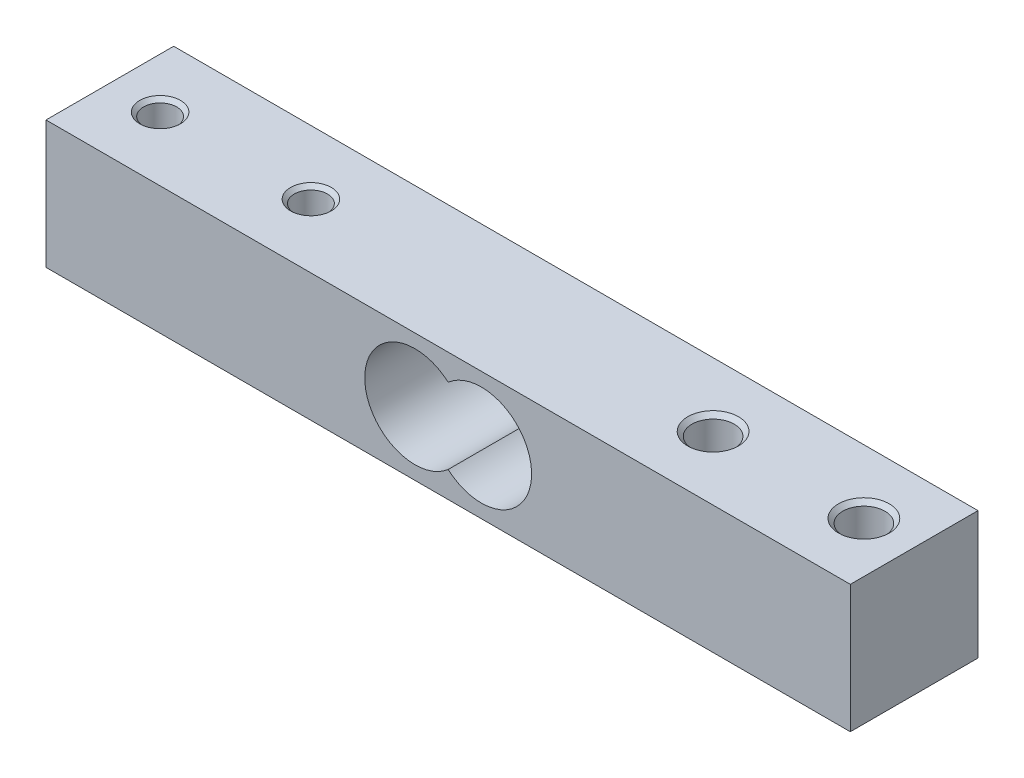
ISO-10303-21;
HEADER;
FILE_DESCRIPTION(('STEP AP214'),'2;1');
FILE_NAME('part.step','',(''),(''),'','','');
FILE_SCHEMA(('AUTOMOTIVE_DESIGN { 1 0 10303 214 1 1 1 1 }'));
ENDSEC;
DATA;
#1=APPLICATION_CONTEXT('core data for automotive mechanical design processes');
#2=APPLICATION_PROTOCOL_DEFINITION('international standard','automotive_design',2000,#1);
#3=PRODUCT_CONTEXT('',#1,'mechanical');
#4=PRODUCT('Part','Part','',(#3));
#5=PRODUCT_RELATED_PRODUCT_CATEGORY('part','',(#4));
#6=PRODUCT_DEFINITION_FORMATION('','',#4);
#7=PRODUCT_DEFINITION_CONTEXT('part definition',#1,'design');
#8=PRODUCT_DEFINITION('design','',#6,#7);
#9=PRODUCT_DEFINITION_SHAPE('','',#8);
#10=(LENGTH_UNIT() NAMED_UNIT(*) SI_UNIT(.MILLI.,.METRE.));
#11=(NAMED_UNIT(*) PLANE_ANGLE_UNIT() SI_UNIT($,.RADIAN.));
#12=(NAMED_UNIT(*) SI_UNIT($,.STERADIAN.) SOLID_ANGLE_UNIT());
#13=UNCERTAINTY_MEASURE_WITH_UNIT(LENGTH_MEASURE(1.E-05),#10,'distance_accuracy_value','');
#14=(GEOMETRIC_REPRESENTATION_CONTEXT(3) GLOBAL_UNCERTAINTY_ASSIGNED_CONTEXT((#13)) GLOBAL_UNIT_ASSIGNED_CONTEXT((#10,
#11,#12)) REPRESENTATION_CONTEXT('',''));
#15=CARTESIAN_POINT('',(0.,0.,0.));
#16=DIRECTION('',(0.,0.,1.));
#17=DIRECTION('',(1.,0.,0.));
#18=AXIS2_PLACEMENT_3D('',#15,#16,#17);
#19=CARTESIAN_POINT('',(40.,12.7,6.35));
#20=DIRECTION('',(-1.,0.,0.));
#21=DIRECTION('',(0.,0.,1.));
#22=AXIS2_PLACEMENT_3D('',#19,#20,#21);
#23=PLANE('',#22);
#24=DIRECTION('',(0.,0.,-1.));
#25=VECTOR('',#24,1.);
#26=CARTESIAN_POINT('',(40.,0.,6.35));
#27=LINE('',#26,#25);
#28=CARTESIAN_POINT('',(40.,0.,6.35));
#29=VERTEX_POINT('',#28);
#30=CARTESIAN_POINT('',(40.,0.,-6.35));
#31=VERTEX_POINT('',#30);
#32=EDGE_CURVE('E124',#29,#31,#27,.T.);
#33=ORIENTED_EDGE('',*,*,#32,.T.);
#34=DIRECTION('',(0.,-1.,0.));
#35=VECTOR('',#34,1.);
#36=CARTESIAN_POINT('',(40.,12.7,-6.35));
#37=LINE('',#36,#35);
#38=CARTESIAN_POINT('',(40.,12.7,-6.35));
#39=VERTEX_POINT('',#38);
#40=EDGE_CURVE('E11',#39,#31,#37,.T.);
#41=ORIENTED_EDGE('',*,*,#40,.F.);
#42=DIRECTION('',(0.,0.,-1.));
#43=VECTOR('',#42,1.);
#44=CARTESIAN_POINT('',(40.,12.7,6.35));
#45=LINE('',#44,#43);
#46=CARTESIAN_POINT('',(40.,12.7,6.35));
#47=VERTEX_POINT('',#46);
#48=EDGE_CURVE('E126',#47,#39,#45,.T.);
#49=ORIENTED_EDGE('',*,*,#48,.F.);
#50=DIRECTION('',(0.,-1.,0.));
#51=VECTOR('',#50,1.);
#52=CARTESIAN_POINT('',(40.,12.7,6.35));
#53=LINE('',#52,#51);
#54=EDGE_CURVE('E136',#47,#29,#53,.T.);
#55=ORIENTED_EDGE('',*,*,#54,.T.);
#56=EDGE_LOOP('',(#33,#41,#49,#55));
#57=FACE_BOUND('',#56,.T.);
#58=ADVANCED_FACE('F53',(#57),#23,.F.);
#59=CARTESIAN_POINT('',(-40.,12.7,-6.35));
#60=DIRECTION('',(0.,0.,1.));
#61=DIRECTION('',(1.,0.,0.));
#62=AXIS2_PLACEMENT_3D('',#59,#60,#61);
#63=PLANE('',#62);
#64=CARTESIAN_POINT('',(-3.3,6.35,-6.35));
#65=DIRECTION('',(0.,0.,1.));
#66=DIRECTION('',(1.,0.,0.));
#67=AXIS2_PLACEMENT_3D('',#64,#65,#66);
#68=CIRCLE('',#67,5.);
#69=CARTESIAN_POINT('',(0.,10.1063279941986,-6.35));
#70=VERTEX_POINT('',#69);
#71=CARTESIAN_POINT('',(0.,2.59367200580141,-6.35));
#72=VERTEX_POINT('',#71);
#73=EDGE_CURVE('E108',#70,#72,#68,.T.);
#74=ORIENTED_EDGE('',*,*,#73,.T.);
#75=CARTESIAN_POINT('',(3.3,6.35,-6.35));
#76=DIRECTION('',(0.,0.,1.));
#77=DIRECTION('',(1.,0.,0.));
#78=AXIS2_PLACEMENT_3D('',#75,#76,#77);
#79=CIRCLE('',#78,5.);
#80=EDGE_CURVE('E67',#72,#70,#79,.T.);
#81=ORIENTED_EDGE('',*,*,#80,.T.);
#82=EDGE_LOOP('',(#74,#81));
#83=FACE_BOUND('',#82,.T.);
#84=DIRECTION('',(-1.,0.,0.));
#85=VECTOR('',#84,1.);
#86=CARTESIAN_POINT('',(-40.,0.,-6.35));
#87=LINE('',#86,#85);
#88=CARTESIAN_POINT('',(-40.,0.,-6.35));
#89=VERTEX_POINT('',#88);
#90=EDGE_CURVE('E139',#31,#89,#87,.T.);
#91=ORIENTED_EDGE('',*,*,#90,.T.);
#92=DIRECTION('',(0.,-1.,0.));
#93=VECTOR('',#92,1.);
#94=CARTESIAN_POINT('',(-40.,12.7,-6.35));
#95=LINE('',#94,#93);
#96=CARTESIAN_POINT('',(-40.,12.7,-6.35));
#97=VERTEX_POINT('',#96);
#98=EDGE_CURVE('E60',#97,#89,#95,.T.);
#99=ORIENTED_EDGE('',*,*,#98,.F.);
#100=DIRECTION('',(-1.,0.,0.));
#101=VECTOR('',#100,1.);
#102=CARTESIAN_POINT('',(-40.,12.7,-6.35));
#103=LINE('',#102,#101);
#104=EDGE_CURVE('E129',#39,#97,#103,.T.);
#105=ORIENTED_EDGE('',*,*,#104,.F.);
#106=ORIENTED_EDGE('',*,*,#40,.T.);
#107=EDGE_LOOP('',(#91,#99,#105,#106));
#108=FACE_BOUND('',#107,.T.);
#109=ADVANCED_FACE('F114',(#83,#108),#63,.F.);
#110=CARTESIAN_POINT('',(-40.,12.7,6.35));
#111=DIRECTION('',(1.,0.,0.));
#112=DIRECTION('',(0.,0.,-1.));
#113=AXIS2_PLACEMENT_3D('',#110,#111,#112);
#114=PLANE('',#113);
#115=DIRECTION('',(0.,0.,1.));
#116=VECTOR('',#115,1.);
#117=CARTESIAN_POINT('',(-40.,0.,6.35));
#118=LINE('',#117,#116);
#119=CARTESIAN_POINT('',(-40.,0.,6.35));
#120=VERTEX_POINT('',#119);
#121=EDGE_CURVE('E141',#89,#120,#118,.T.);
#122=ORIENTED_EDGE('',*,*,#121,.T.);
#123=DIRECTION('',(0.,-1.,0.));
#124=VECTOR('',#123,1.);
#125=CARTESIAN_POINT('',(-40.,12.7,6.35));
#126=LINE('',#125,#124);
#127=CARTESIAN_POINT('',(-40.,12.7,6.35));
#128=VERTEX_POINT('',#127);
#129=EDGE_CURVE('E146',#128,#120,#126,.T.);
#130=ORIENTED_EDGE('',*,*,#129,.F.);
#131=DIRECTION('',(0.,0.,1.));
#132=VECTOR('',#131,1.);
#133=CARTESIAN_POINT('',(-40.,12.7,6.35));
#134=LINE('',#133,#132);
#135=EDGE_CURVE('E132',#97,#128,#134,.T.);
#136=ORIENTED_EDGE('',*,*,#135,.F.);
#137=ORIENTED_EDGE('',*,*,#98,.T.);
#138=EDGE_LOOP('',(#122,#130,#136,#137));
#139=FACE_BOUND('',#138,.T.);
#140=ADVANCED_FACE('F153',(#139),#114,.F.);
#141=CARTESIAN_POINT('',(-40.,12.7,6.35));
#142=DIRECTION('',(0.,0.,-1.));
#143=DIRECTION('',(-1.,0.,0.));
#144=AXIS2_PLACEMENT_3D('',#141,#142,#143);
#145=PLANE('',#144);
#146=CARTESIAN_POINT('',(-3.3,6.35,6.35));
#147=DIRECTION('',(0.,0.,1.));
#148=DIRECTION('',(1.,0.,0.));
#149=AXIS2_PLACEMENT_3D('',#146,#147,#148);
#150=CIRCLE('',#149,5.);
#151=CARTESIAN_POINT('',(0.,10.1063279941986,6.35));
#152=VERTEX_POINT('',#151);
#153=CARTESIAN_POINT('',(0.,2.59367200580141,6.35));
#154=VERTEX_POINT('',#153);
#155=EDGE_CURVE('E116',#152,#154,#150,.T.);
#156=ORIENTED_EDGE('',*,*,#155,.F.);
#157=CARTESIAN_POINT('',(3.3,6.35,6.35));
#158=DIRECTION('',(0.,0.,1.));
#159=DIRECTION('',(1.,0.,0.));
#160=AXIS2_PLACEMENT_3D('',#157,#158,#159);
#161=CIRCLE('',#160,5.);
#162=EDGE_CURVE('E72',#154,#152,#161,.T.);
#163=ORIENTED_EDGE('',*,*,#162,.F.);
#164=EDGE_LOOP('',(#156,#163));
#165=FACE_BOUND('',#164,.T.);
#166=DIRECTION('',(1.,0.,0.));
#167=VECTOR('',#166,1.);
#168=CARTESIAN_POINT('',(-40.,0.,6.35));
#169=LINE('',#168,#167);
#170=EDGE_CURVE('E130',#120,#29,#169,.T.);
#171=ORIENTED_EDGE('',*,*,#170,.T.);
#172=ORIENTED_EDGE('',*,*,#54,.F.);
#173=DIRECTION('',(1.,0.,0.));
#174=VECTOR('',#173,1.);
#175=CARTESIAN_POINT('',(-40.,12.7,6.35));
#176=LINE('',#175,#174);
#177=EDGE_CURVE('E134',#128,#47,#176,.T.);
#178=ORIENTED_EDGE('',*,*,#177,.F.);
#179=ORIENTED_EDGE('',*,*,#129,.T.);
#180=EDGE_LOOP('',(#171,#172,#178,#179));
#181=FACE_BOUND('',#180,.T.);
#182=ADVANCED_FACE('F161',(#165,#181),#145,.F.);
#183=CARTESIAN_POINT('',(0.,12.7,0.));
#184=DIRECTION('',(0.,-1.,0.));
#185=DIRECTION('',(0.,0.,-1.));
#186=AXIS2_PLACEMENT_3D('',#183,#184,#185);
#187=PLANE('',#186);
#188=CARTESIAN_POINT('',(35.,12.7,0.));
#189=DIRECTION('',(0.,1.,0.));
#190=DIRECTION('',(0.,0.,1.));
#191=AXIS2_PLACEMENT_3D('',#188,#189,#190);
#192=CIRCLE('',#191,2.525);
#193=CARTESIAN_POINT('',(35.,12.7,2.525));
#194=VERTEX_POINT('',#193);
#195=EDGE_CURVE('E228',#194,#194,#192,.T.);
#196=ORIENTED_EDGE('',*,*,#195,.F.);
#197=EDGE_LOOP('',(#196));
#198=FACE_BOUND('',#197,.T.);
#199=CARTESIAN_POINT('',(20.,12.7,0.));
#200=DIRECTION('',(0.,1.,0.));
#201=DIRECTION('',(0.,0.,1.));
#202=AXIS2_PLACEMENT_3D('',#199,#200,#201);
#203=CIRCLE('',#202,2.525);
#204=CARTESIAN_POINT('',(20.,12.7,2.525));
#205=VERTEX_POINT('',#204);
#206=EDGE_CURVE('E235',#205,#205,#203,.T.);
#207=ORIENTED_EDGE('',*,*,#206,.F.);
#208=EDGE_LOOP('',(#207));
#209=FACE_BOUND('',#208,.T.);
#210=CARTESIAN_POINT('',(-35.,12.7,0.));
#211=DIRECTION('',(0.,1.,0.));
#212=DIRECTION('',(0.,0.,1.));
#213=AXIS2_PLACEMENT_3D('',#210,#211,#212);
#214=CIRCLE('',#213,2.025);
#215=CARTESIAN_POINT('',(-35.,12.7,2.025));
#216=VERTEX_POINT('',#215);
#217=EDGE_CURVE('E244',#216,#216,#214,.T.);
#218=ORIENTED_EDGE('',*,*,#217,.F.);
#219=EDGE_LOOP('',(#218));
#220=FACE_BOUND('',#219,.T.);
#221=CARTESIAN_POINT('',(-20.,12.7,0.));
#222=DIRECTION('',(0.,1.,0.));
#223=DIRECTION('',(0.,0.,1.));
#224=AXIS2_PLACEMENT_3D('',#221,#222,#223);
#225=CIRCLE('',#224,2.025);
#226=CARTESIAN_POINT('',(-20.,12.7,2.025));
#227=VERTEX_POINT('',#226);
#228=EDGE_CURVE('E253',#227,#227,#225,.T.);
#229=ORIENTED_EDGE('',*,*,#228,.F.);
#230=EDGE_LOOP('',(#229));
#231=FACE_BOUND('',#230,.T.);
#232=ORIENTED_EDGE('',*,*,#48,.T.);
#233=ORIENTED_EDGE('',*,*,#104,.T.);
#234=ORIENTED_EDGE('',*,*,#135,.T.);
#235=ORIENTED_EDGE('',*,*,#177,.T.);
#236=EDGE_LOOP('',(#232,#233,#234,#235));
#237=FACE_BOUND('',#236,.T.);
#238=ADVANCED_FACE('F167',(#198,#209,#220,#231,#237),#187,.F.);
#239=CARTESIAN_POINT('',(0.,0.,0.));
#240=DIRECTION('',(0.,-1.,0.));
#241=DIRECTION('',(0.,0.,-1.));
#242=AXIS2_PLACEMENT_3D('',#239,#240,#241);
#243=PLANE('',#242);
#244=CARTESIAN_POINT('',(35.,0.,0.));
#245=DIRECTION('',(0.,1.,0.));
#246=DIRECTION('',(0.,0.,1.));
#247=AXIS2_PLACEMENT_3D('',#244,#245,#246);
#248=CIRCLE('',#247,2.1);
#249=CARTESIAN_POINT('',(35.,0.,2.1));
#250=VERTEX_POINT('',#249);
#251=EDGE_CURVE('E230',#250,#250,#248,.T.);
#252=ORIENTED_EDGE('',*,*,#251,.T.);
#253=EDGE_LOOP('',(#252));
#254=FACE_BOUND('',#253,.T.);
#255=CARTESIAN_POINT('',(20.,0.,0.));
#256=DIRECTION('',(0.,1.,0.));
#257=DIRECTION('',(0.,0.,1.));
#258=AXIS2_PLACEMENT_3D('',#255,#256,#257);
#259=CIRCLE('',#258,2.1);
#260=CARTESIAN_POINT('',(20.,0.,2.1));
#261=VERTEX_POINT('',#260);
#262=EDGE_CURVE('E241',#261,#261,#259,.T.);
#263=ORIENTED_EDGE('',*,*,#262,.T.);
#264=EDGE_LOOP('',(#263));
#265=FACE_BOUND('',#264,.T.);
#266=CARTESIAN_POINT('',(-35.,0.,0.));
#267=DIRECTION('',(0.,1.,0.));
#268=DIRECTION('',(0.,0.,1.));
#269=AXIS2_PLACEMENT_3D('',#266,#267,#268);
#270=CIRCLE('',#269,1.65);
#271=CARTESIAN_POINT('',(-35.,0.,1.65));
#272=VERTEX_POINT('',#271);
#273=EDGE_CURVE('E250',#272,#272,#270,.T.);
#274=ORIENTED_EDGE('',*,*,#273,.T.);
#275=EDGE_LOOP('',(#274));
#276=FACE_BOUND('',#275,.T.);
#277=CARTESIAN_POINT('',(-20.,0.,0.));
#278=DIRECTION('',(0.,1.,0.));
#279=DIRECTION('',(0.,0.,1.));
#280=AXIS2_PLACEMENT_3D('',#277,#278,#279);
#281=CIRCLE('',#280,1.65);
#282=CARTESIAN_POINT('',(-20.,0.,1.65));
#283=VERTEX_POINT('',#282);
#284=EDGE_CURVE('E120',#283,#283,#281,.T.);
#285=ORIENTED_EDGE('',*,*,#284,.T.);
#286=EDGE_LOOP('',(#285));
#287=FACE_BOUND('',#286,.T.);
#288=ORIENTED_EDGE('',*,*,#32,.F.);
#289=ORIENTED_EDGE('',*,*,#170,.F.);
#290=ORIENTED_EDGE('',*,*,#121,.F.);
#291=ORIENTED_EDGE('',*,*,#90,.F.);
#292=EDGE_LOOP('',(#288,#289,#290,#291));
#293=FACE_BOUND('',#292,.T.);
#294=ADVANCED_FACE('F158',(#254,#265,#276,#287,#293),#243,.T.);
#295=CARTESIAN_POINT('',(3.3,6.35,-6.35));
#296=DIRECTION('',(0.,0.,1.));
#297=DIRECTION('',(1.,0.,0.));
#298=AXIS2_PLACEMENT_3D('',#295,#296,#297);
#299=CYLINDRICAL_SURFACE('',#298,5.);
#300=ORIENTED_EDGE('',*,*,#162,.T.);
#301=DIRECTION('',(0.,0.,1.));
#302=VECTOR('',#301,1.);
#303=CARTESIAN_POINT('',(0.,10.1063279941986,-6.35));
#304=LINE('',#303,#302);
#305=EDGE_CURVE('E101',#70,#152,#304,.T.);
#306=ORIENTED_EDGE('',*,*,#305,.F.);
#307=ORIENTED_EDGE('',*,*,#80,.F.);
#308=DIRECTION('',(0.,0.,1.));
#309=VECTOR('',#308,1.);
#310=CARTESIAN_POINT('',(0.,2.59367200580141,-6.35));
#311=LINE('',#310,#309);
#312=EDGE_CURVE('E107',#72,#154,#311,.T.);
#313=ORIENTED_EDGE('',*,*,#312,.T.);
#314=EDGE_LOOP('',(#300,#306,#307,#313));
#315=FACE_BOUND('',#314,.T.);
#316=ADVANCED_FACE('F103',(#315),#299,.F.);
#317=CARTESIAN_POINT('',(-3.3,6.35,-6.35));
#318=DIRECTION('',(0.,0.,1.));
#319=DIRECTION('',(1.,0.,0.));
#320=AXIS2_PLACEMENT_3D('',#317,#318,#319);
#321=CYLINDRICAL_SURFACE('',#320,5.);
#322=ORIENTED_EDGE('',*,*,#155,.T.);
#323=ORIENTED_EDGE('',*,*,#312,.F.);
#324=ORIENTED_EDGE('',*,*,#73,.F.);
#325=ORIENTED_EDGE('',*,*,#305,.T.);
#326=EDGE_LOOP('',(#322,#323,#324,#325));
#327=FACE_BOUND('',#326,.T.);
#328=ADVANCED_FACE('F111',(#327),#321,.F.);
#329=CARTESIAN_POINT('',(-20.,12.7,0.));
#330=DIRECTION('',(0.,1.,0.));
#331=DIRECTION('',(0.,0.,1.));
#332=AXIS2_PLACEMENT_3D('',#329,#330,#331);
#333=CYLINDRICAL_SURFACE('',#332,1.65);
#334=ORIENTED_EDGE('',*,*,#284,.F.);
#335=EDGE_LOOP('',(#334));
#336=FACE_BOUND('',#335,.T.);
#337=CARTESIAN_POINT('',(-20.,12.325,0.));
#338=DIRECTION('',(0.,1.,0.));
#339=DIRECTION('',(0.,0.,1.));
#340=AXIS2_PLACEMENT_3D('',#337,#338,#339);
#341=CIRCLE('',#340,1.65);
#342=CARTESIAN_POINT('',(-20.,12.325,1.65));
#343=VERTEX_POINT('',#342);
#344=EDGE_CURVE('E255',#343,#343,#341,.T.);
#345=ORIENTED_EDGE('',*,*,#344,.T.);
#346=EDGE_LOOP('',(#345));
#347=FACE_BOUND('',#346,.T.);
#348=ADVANCED_FACE('F188',(#336,#347),#333,.F.);
#349=CARTESIAN_POINT('',(-20.,12.7,0.));
#350=DIRECTION('',(0.,1.,0.));
#351=DIRECTION('',(0.,0.,1.));
#352=AXIS2_PLACEMENT_3D('',#349,#350,#351);
#353=CONICAL_SURFACE('',#352,2.025,0.785398163397446);
#354=ORIENTED_EDGE('',*,*,#344,.F.);
#355=EDGE_LOOP('',(#354));
#356=FACE_BOUND('',#355,.T.);
#357=ORIENTED_EDGE('',*,*,#228,.T.);
#358=EDGE_LOOP('',(#357));
#359=FACE_BOUND('',#358,.T.);
#360=ADVANCED_FACE('F191',(#356,#359),#353,.F.);
#361=CARTESIAN_POINT('',(-35.,12.7,0.));
#362=DIRECTION('',(0.,1.,0.));
#363=DIRECTION('',(0.,0.,1.));
#364=AXIS2_PLACEMENT_3D('',#361,#362,#363);
#365=CYLINDRICAL_SURFACE('',#364,1.65);
#366=ORIENTED_EDGE('',*,*,#273,.F.);
#367=EDGE_LOOP('',(#366));
#368=FACE_BOUND('',#367,.T.);
#369=CARTESIAN_POINT('',(-35.,12.325,0.));
#370=DIRECTION('',(0.,1.,0.));
#371=DIRECTION('',(0.,0.,1.));
#372=AXIS2_PLACEMENT_3D('',#369,#370,#371);
#373=CIRCLE('',#372,1.65);
#374=CARTESIAN_POINT('',(-35.,12.325,1.65));
#375=VERTEX_POINT('',#374);
#376=EDGE_CURVE('E247',#375,#375,#373,.T.);
#377=ORIENTED_EDGE('',*,*,#376,.T.);
#378=EDGE_LOOP('',(#377));
#379=FACE_BOUND('',#378,.T.);
#380=ADVANCED_FACE('F195',(#368,#379),#365,.F.);
#381=CARTESIAN_POINT('',(-35.,12.7,0.));
#382=DIRECTION('',(0.,1.,0.));
#383=DIRECTION('',(0.,0.,1.));
#384=AXIS2_PLACEMENT_3D('',#381,#382,#383);
#385=CONICAL_SURFACE('',#384,2.025,0.785398163397446);
#386=ORIENTED_EDGE('',*,*,#376,.F.);
#387=EDGE_LOOP('',(#386));
#388=FACE_BOUND('',#387,.T.);
#389=ORIENTED_EDGE('',*,*,#217,.T.);
#390=EDGE_LOOP('',(#389));
#391=FACE_BOUND('',#390,.T.);
#392=ADVANCED_FACE('F199',(#388,#391),#385,.F.);
#393=CARTESIAN_POINT('',(20.,12.7,0.));
#394=DIRECTION('',(0.,1.,0.));
#395=DIRECTION('',(0.,0.,1.));
#396=AXIS2_PLACEMENT_3D('',#393,#394,#395);
#397=CYLINDRICAL_SURFACE('',#396,2.1);
#398=ORIENTED_EDGE('',*,*,#262,.F.);
#399=EDGE_LOOP('',(#398));
#400=FACE_BOUND('',#399,.T.);
#401=CARTESIAN_POINT('',(20.,12.275,0.));
#402=DIRECTION('',(0.,1.,0.));
#403=DIRECTION('',(0.,0.,1.));
#404=AXIS2_PLACEMENT_3D('',#401,#402,#403);
#405=CIRCLE('',#404,2.1);
#406=CARTESIAN_POINT('',(20.,12.275,2.1));
#407=VERTEX_POINT('',#406);
#408=EDGE_CURVE('E238',#407,#407,#405,.T.);
#409=ORIENTED_EDGE('',*,*,#408,.T.);
#410=EDGE_LOOP('',(#409));
#411=FACE_BOUND('',#410,.T.);
#412=ADVANCED_FACE('F203',(#400,#411),#397,.F.);
#413=CARTESIAN_POINT('',(20.,12.7,0.));
#414=DIRECTION('',(0.,1.,0.));
#415=DIRECTION('',(0.,0.,1.));
#416=AXIS2_PLACEMENT_3D('',#413,#414,#415);
#417=CONICAL_SURFACE('',#416,2.525,0.785398163397448);
#418=ORIENTED_EDGE('',*,*,#408,.F.);
#419=EDGE_LOOP('',(#418));
#420=FACE_BOUND('',#419,.T.);
#421=ORIENTED_EDGE('',*,*,#206,.T.);
#422=EDGE_LOOP('',(#421));
#423=FACE_BOUND('',#422,.T.);
#424=ADVANCED_FACE('F207',(#420,#423),#417,.F.);
#425=CARTESIAN_POINT('',(35.,12.7,0.));
#426=DIRECTION('',(0.,1.,0.));
#427=DIRECTION('',(0.,0.,1.));
#428=AXIS2_PLACEMENT_3D('',#425,#426,#427);
#429=CYLINDRICAL_SURFACE('',#428,2.1);
#430=ORIENTED_EDGE('',*,*,#251,.F.);
#431=EDGE_LOOP('',(#430));
#432=FACE_BOUND('',#431,.T.);
#433=CARTESIAN_POINT('',(35.,12.275,0.));
#434=DIRECTION('',(0.,1.,0.));
#435=DIRECTION('',(0.,0.,1.));
#436=AXIS2_PLACEMENT_3D('',#433,#434,#435);
#437=CIRCLE('',#436,2.1);
#438=CARTESIAN_POINT('',(35.,12.275,2.1));
#439=VERTEX_POINT('',#438);
#440=EDGE_CURVE('E225',#439,#439,#437,.T.);
#441=ORIENTED_EDGE('',*,*,#440,.T.);
#442=EDGE_LOOP('',(#441));
#443=FACE_BOUND('',#442,.T.);
#444=ADVANCED_FACE('F211',(#432,#443),#429,.F.);
#445=CARTESIAN_POINT('',(35.,12.7,0.));
#446=DIRECTION('',(0.,1.,0.));
#447=DIRECTION('',(0.,0.,1.));
#448=AXIS2_PLACEMENT_3D('',#445,#446,#447);
#449=CONICAL_SURFACE('',#448,2.525,0.785398163397448);
#450=ORIENTED_EDGE('',*,*,#440,.F.);
#451=EDGE_LOOP('',(#450));
#452=FACE_BOUND('',#451,.T.);
#453=ORIENTED_EDGE('',*,*,#195,.T.);
#454=EDGE_LOOP('',(#453));
#455=FACE_BOUND('',#454,.T.);
#456=ADVANCED_FACE('F215',(#452,#455),#449,.F.);
#457=CLOSED_SHELL('',(#58,#109,#140,#182,#238,#294,#316,#328,#348,#360,#380,#392,#412,#424,#444,#456));
#458=MANIFOLD_SOLID_BREP('B2',#457);
#459=ADVANCED_BREP_SHAPE_REPRESENTATION('',(#18,#458),#14);
#460=SHAPE_DEFINITION_REPRESENTATION(#9,#459);
ENDSEC;
END-ISO-10303-21;
